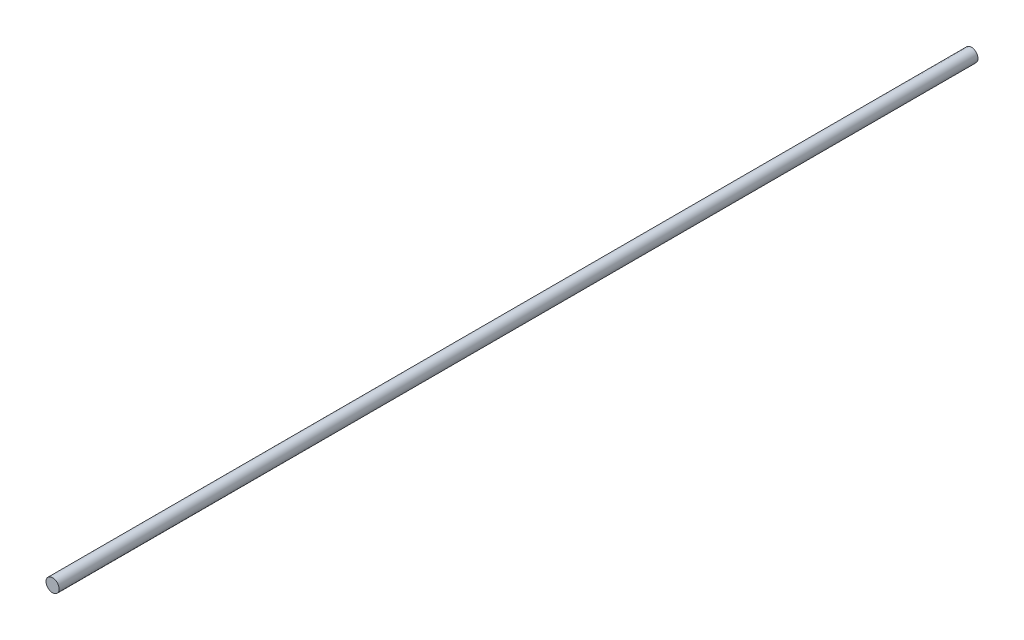
ISO-10303-21;
HEADER;
FILE_DESCRIPTION(('STEP AP214'),'2;1');
FILE_NAME('part.step','',(''),(''),'','','');
FILE_SCHEMA(('AUTOMOTIVE_DESIGN { 1 0 10303 214 1 1 1 1 }'));
ENDSEC;
DATA;
#1=APPLICATION_CONTEXT('core data for automotive mechanical design processes');
#2=APPLICATION_PROTOCOL_DEFINITION('international standard','automotive_design',2000,#1);
#3=PRODUCT_CONTEXT('',#1,'mechanical');
#4=PRODUCT('Part','Part','',(#3));
#5=PRODUCT_RELATED_PRODUCT_CATEGORY('part','',(#4));
#6=PRODUCT_DEFINITION_FORMATION('','',#4);
#7=PRODUCT_DEFINITION_CONTEXT('part definition',#1,'design');
#8=PRODUCT_DEFINITION('design','',#6,#7);
#9=PRODUCT_DEFINITION_SHAPE('','',#8);
#10=(LENGTH_UNIT() NAMED_UNIT(*) SI_UNIT(.MILLI.,.METRE.));
#11=(NAMED_UNIT(*) PLANE_ANGLE_UNIT() SI_UNIT($,.RADIAN.));
#12=(NAMED_UNIT(*) SI_UNIT($,.STERADIAN.) SOLID_ANGLE_UNIT());
#13=UNCERTAINTY_MEASURE_WITH_UNIT(LENGTH_MEASURE(1.E-05),#10,'distance_accuracy_value','');
#14=(GEOMETRIC_REPRESENTATION_CONTEXT(3) GLOBAL_UNCERTAINTY_ASSIGNED_CONTEXT((#13)) GLOBAL_UNIT_ASSIGNED_CONTEXT((#10,
#11,#12)) REPRESENTATION_CONTEXT('',''));
#15=CARTESIAN_POINT('',(0.,0.,0.));
#16=DIRECTION('',(0.,0.,1.));
#17=DIRECTION('',(1.,0.,0.));
#18=AXIS2_PLACEMENT_3D('',#15,#16,#17);
#19=CARTESIAN_POINT('',(0.,0.,420.));
#20=DIRECTION('',(0.,0.,-1.));
#21=DIRECTION('',(-1.,0.,0.));
#22=AXIS2_PLACEMENT_3D('',#19,#20,#21);
#23=CYLINDRICAL_SURFACE('',#22,3.);
#24=CARTESIAN_POINT('',(0.,0.,420.));
#25=DIRECTION('',(0.,0.,1.));
#26=DIRECTION('',(1.,0.,0.));
#27=AXIS2_PLACEMENT_3D('',#24,#25,#26);
#28=CIRCLE('',#27,3.);
#29=CARTESIAN_POINT('',(3.,0.,420.));
#30=VERTEX_POINT('',#29);
#31=EDGE_CURVE('E10',#30,#30,#28,.T.);
#32=ORIENTED_EDGE('',*,*,#31,.F.);
#33=EDGE_LOOP('',(#32));
#34=FACE_BOUND('',#33,.T.);
#35=CARTESIAN_POINT('',(0.,0.,0.));
#36=DIRECTION('',(0.,0.,1.));
#37=DIRECTION('',(1.,0.,0.));
#38=AXIS2_PLACEMENT_3D('',#35,#36,#37);
#39=CIRCLE('',#38,3.);
#40=CARTESIAN_POINT('',(3.,0.,0.));
#41=VERTEX_POINT('',#40);
#42=EDGE_CURVE('E34',#41,#41,#39,.T.);
#43=ORIENTED_EDGE('',*,*,#42,.T.);
#44=EDGE_LOOP('',(#43));
#45=FACE_BOUND('',#44,.T.);
#46=ADVANCED_FACE('F31',(#34,#45),#23,.T.);
#47=CARTESIAN_POINT('',(0.,0.,420.));
#48=DIRECTION('',(0.,0.,1.));
#49=DIRECTION('',(1.,0.,0.));
#50=AXIS2_PLACEMENT_3D('',#47,#48,#49);
#51=PLANE('',#50);
#52=ORIENTED_EDGE('',*,*,#31,.T.);
#53=EDGE_LOOP('',(#52));
#54=FACE_BOUND('',#53,.T.);
#55=ADVANCED_FACE('F46',(#54),#51,.T.);
#56=CARTESIAN_POINT('',(0.,0.,0.));
#57=DIRECTION('',(0.,0.,1.));
#58=DIRECTION('',(1.,0.,0.));
#59=AXIS2_PLACEMENT_3D('',#56,#57,#58);
#60=PLANE('',#59);
#61=ORIENTED_EDGE('',*,*,#42,.F.);
#62=EDGE_LOOP('',(#61));
#63=FACE_BOUND('',#62,.T.);
#64=ADVANCED_FACE('F44',(#63),#60,.F.);
#65=CLOSED_SHELL('',(#46,#55,#64));
#66=MANIFOLD_SOLID_BREP('B2',#65);
#67=ADVANCED_BREP_SHAPE_REPRESENTATION('',(#18,#66),#14);
#68=SHAPE_DEFINITION_REPRESENTATION(#9,#67);
ENDSEC;
END-ISO-10303-21;
